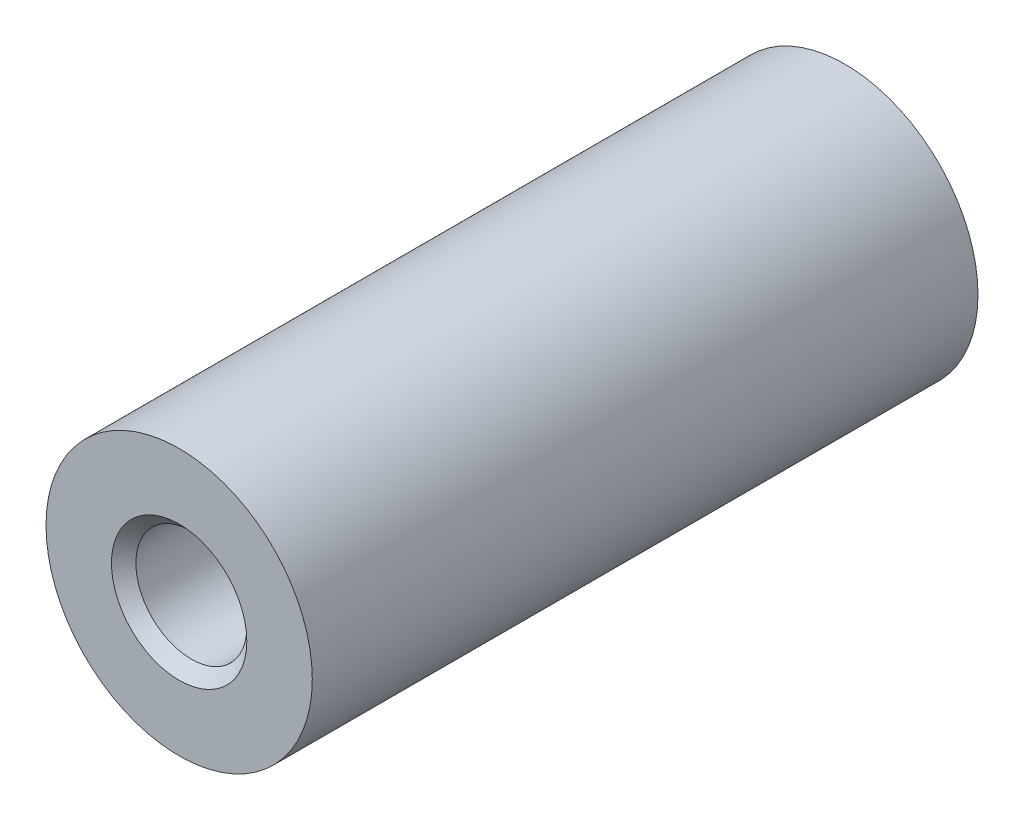
ISO-10303-21;
HEADER;
FILE_DESCRIPTION(('STEP AP214'),'2;1');
FILE_NAME('part.step','',(''),(''),'','','');
FILE_SCHEMA(('AUTOMOTIVE_DESIGN { 1 0 10303 214 1 1 1 1 }'));
ENDSEC;
DATA;
#1=APPLICATION_CONTEXT('core data for automotive mechanical design processes');
#2=APPLICATION_PROTOCOL_DEFINITION('international standard','automotive_design',2000,#1);
#3=PRODUCT_CONTEXT('',#1,'mechanical');
#4=PRODUCT('Part','Part','',(#3));
#5=PRODUCT_RELATED_PRODUCT_CATEGORY('part','',(#4));
#6=PRODUCT_DEFINITION_FORMATION('','',#4);
#7=PRODUCT_DEFINITION_CONTEXT('part definition',#1,'design');
#8=PRODUCT_DEFINITION('design','',#6,#7);
#9=PRODUCT_DEFINITION_SHAPE('','',#8);
#10=(LENGTH_UNIT() NAMED_UNIT(*) SI_UNIT(.MILLI.,.METRE.));
#11=(NAMED_UNIT(*) PLANE_ANGLE_UNIT() SI_UNIT($,.RADIAN.));
#12=(NAMED_UNIT(*) SI_UNIT($,.STERADIAN.) SOLID_ANGLE_UNIT());
#13=UNCERTAINTY_MEASURE_WITH_UNIT(LENGTH_MEASURE(1.E-05),#10,'distance_accuracy_value','');
#14=(GEOMETRIC_REPRESENTATION_CONTEXT(3) GLOBAL_UNCERTAINTY_ASSIGNED_CONTEXT((#13)) GLOBAL_UNIT_ASSIGNED_CONTEXT((#10,
#11,#12)) REPRESENTATION_CONTEXT('',''));
#15=CARTESIAN_POINT('',(0.,0.,0.));
#16=DIRECTION('',(0.,0.,1.));
#17=DIRECTION('',(1.,0.,0.));
#18=AXIS2_PLACEMENT_3D('',#15,#16,#17);
#19=CARTESIAN_POINT('',(0.,0.,15.));
#20=DIRECTION('',(0.,0.,-1.));
#21=DIRECTION('',(-1.,0.,0.));
#22=AXIS2_PLACEMENT_3D('',#19,#20,#21);
#23=CYLINDRICAL_SURFACE('',#22,3.);
#24=CARTESIAN_POINT('',(0.,0.,15.));
#25=DIRECTION('',(0.,0.,1.));
#26=DIRECTION('',(1.,0.,0.));
#27=AXIS2_PLACEMENT_3D('',#24,#25,#26);
#28=CIRCLE('',#27,3.);
#29=CARTESIAN_POINT('',(3.,0.,15.));
#30=VERTEX_POINT('',#29);
#31=EDGE_CURVE('E10',#30,#30,#28,.T.);
#32=ORIENTED_EDGE('',*,*,#31,.F.);
#33=EDGE_LOOP('',(#32));
#34=FACE_BOUND('',#33,.T.);
#35=CARTESIAN_POINT('',(0.,0.,0.));
#36=DIRECTION('',(0.,0.,1.));
#37=DIRECTION('',(1.,0.,0.));
#38=AXIS2_PLACEMENT_3D('',#35,#36,#37);
#39=CIRCLE('',#38,3.);
#40=CARTESIAN_POINT('',(3.,0.,0.));
#41=VERTEX_POINT('',#40);
#42=EDGE_CURVE('E38',#41,#41,#39,.T.);
#43=ORIENTED_EDGE('',*,*,#42,.T.);
#44=EDGE_LOOP('',(#43));
#45=FACE_BOUND('',#44,.T.);
#46=ADVANCED_FACE('F35',(#34,#45),#23,.T.);
#47=CARTESIAN_POINT('',(0.,0.,15.));
#48=DIRECTION('',(0.,0.,1.));
#49=DIRECTION('',(1.,0.,0.));
#50=AXIS2_PLACEMENT_3D('',#47,#48,#49);
#51=PLANE('',#50);
#52=CARTESIAN_POINT('',(0.,0.,15.));
#53=DIRECTION('',(0.,0.,1.));
#54=DIRECTION('',(1.,0.,0.));
#55=AXIS2_PLACEMENT_3D('',#52,#53,#54);
#56=CIRCLE('',#55,1.525);
#57=CARTESIAN_POINT('',(1.525,0.,15.));
#58=VERTEX_POINT('',#57);
#59=EDGE_CURVE('E52',#58,#58,#56,.T.);
#60=ORIENTED_EDGE('',*,*,#59,.F.);
#61=EDGE_LOOP('',(#60));
#62=FACE_BOUND('',#61,.T.);
#63=ORIENTED_EDGE('',*,*,#31,.T.);
#64=EDGE_LOOP('',(#63));
#65=FACE_BOUND('',#64,.T.);
#66=ADVANCED_FACE('F58',(#62,#65),#51,.T.);
#67=CARTESIAN_POINT('',(0.,0.,0.));
#68=DIRECTION('',(0.,0.,1.));
#69=DIRECTION('',(1.,0.,0.));
#70=AXIS2_PLACEMENT_3D('',#67,#68,#69);
#71=PLANE('',#70);
#72=CARTESIAN_POINT('',(0.,0.,0.));
#73=DIRECTION('',(0.,0.,1.));
#74=DIRECTION('',(1.,0.,0.));
#75=AXIS2_PLACEMENT_3D('',#72,#73,#74);
#76=CIRCLE('',#75,1.25);
#77=CARTESIAN_POINT('',(1.25,0.,0.));
#78=VERTEX_POINT('',#77);
#79=EDGE_CURVE('E45',#78,#78,#76,.T.);
#80=ORIENTED_EDGE('',*,*,#79,.T.);
#81=EDGE_LOOP('',(#80));
#82=FACE_BOUND('',#81,.T.);
#83=ORIENTED_EDGE('',*,*,#42,.F.);
#84=EDGE_LOOP('',(#83));
#85=FACE_BOUND('',#84,.T.);
#86=ADVANCED_FACE('F60',(#82,#85),#71,.F.);
#87=CARTESIAN_POINT('',(0.,0.,15.));
#88=DIRECTION('',(0.,0.,1.));
#89=DIRECTION('',(1.,0.,0.));
#90=AXIS2_PLACEMENT_3D('',#87,#88,#89);
#91=CYLINDRICAL_SURFACE('',#90,1.25);
#92=ORIENTED_EDGE('',*,*,#79,.F.);
#93=EDGE_LOOP('',(#92));
#94=FACE_BOUND('',#93,.T.);
#95=CARTESIAN_POINT('',(0.,0.,14.725));
#96=DIRECTION('',(0.,0.,1.));
#97=DIRECTION('',(1.,0.,0.));
#98=AXIS2_PLACEMENT_3D('',#95,#96,#97);
#99=CIRCLE('',#98,1.25);
#100=CARTESIAN_POINT('',(1.25,0.,14.725));
#101=VERTEX_POINT('',#100);
#102=EDGE_CURVE('E49',#101,#101,#99,.T.);
#103=ORIENTED_EDGE('',*,*,#102,.T.);
#104=EDGE_LOOP('',(#103));
#105=FACE_BOUND('',#104,.T.);
#106=ADVANCED_FACE('F66',(#94,#105),#91,.F.);
#107=CARTESIAN_POINT('',(0.,0.,15.));
#108=DIRECTION('',(0.,0.,1.));
#109=DIRECTION('',(1.,0.,0.));
#110=AXIS2_PLACEMENT_3D('',#107,#108,#109);
#111=CONICAL_SURFACE('',#110,1.525,0.785398163397449);
#112=ORIENTED_EDGE('',*,*,#102,.F.);
#113=EDGE_LOOP('',(#112));
#114=FACE_BOUND('',#113,.T.);
#115=ORIENTED_EDGE('',*,*,#59,.T.);
#116=EDGE_LOOP('',(#115));
#117=FACE_BOUND('',#116,.T.);
#118=ADVANCED_FACE('F56',(#114,#117),#111,.F.);
#119=CLOSED_SHELL('',(#46,#66,#86,#106,#118));
#120=MANIFOLD_SOLID_BREP('B2',#119);
#121=ADVANCED_BREP_SHAPE_REPRESENTATION('',(#18,#120),#14);
#122=SHAPE_DEFINITION_REPRESENTATION(#9,#121);
ENDSEC;
END-ISO-10303-21;
